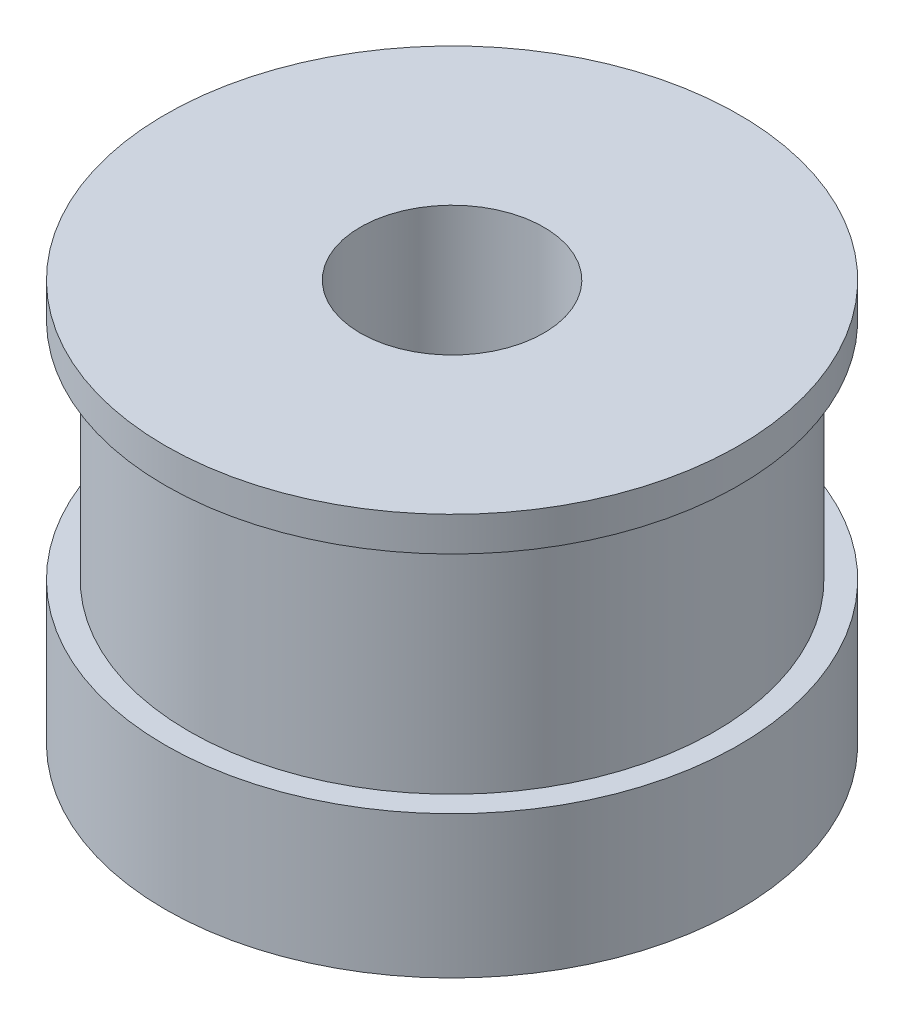
ISO-10303-21;
HEADER;
FILE_DESCRIPTION(('STEP AP214'),'2;1');
FILE_NAME('part.step','',(''),(''),'','','');
FILE_SCHEMA(('AUTOMOTIVE_DESIGN { 1 0 10303 214 1 1 1 1 }'));
ENDSEC;
DATA;
#1=APPLICATION_CONTEXT('core data for automotive mechanical design processes');
#2=APPLICATION_PROTOCOL_DEFINITION('international standard','automotive_design',2000,#1);
#3=PRODUCT_CONTEXT('',#1,'mechanical');
#4=PRODUCT('Part','Part','',(#3));
#5=PRODUCT_RELATED_PRODUCT_CATEGORY('part','',(#4));
#6=PRODUCT_DEFINITION_FORMATION('','',#4);
#7=PRODUCT_DEFINITION_CONTEXT('part definition',#1,'design');
#8=PRODUCT_DEFINITION('design','',#6,#7);
#9=PRODUCT_DEFINITION_SHAPE('','',#8);
#10=(LENGTH_UNIT() NAMED_UNIT(*) SI_UNIT(.MILLI.,.METRE.));
#11=(NAMED_UNIT(*) PLANE_ANGLE_UNIT() SI_UNIT($,.RADIAN.));
#12=(NAMED_UNIT(*) SI_UNIT($,.STERADIAN.) SOLID_ANGLE_UNIT());
#13=UNCERTAINTY_MEASURE_WITH_UNIT(LENGTH_MEASURE(1.E-05),#10,'distance_accuracy_value','');
#14=(GEOMETRIC_REPRESENTATION_CONTEXT(3) GLOBAL_UNCERTAINTY_ASSIGNED_CONTEXT((#13)) GLOBAL_UNIT_ASSIGNED_CONTEXT((#10,
#11,#12)) REPRESENTATION_CONTEXT('',''));
#15=CARTESIAN_POINT('',(0.,0.,0.));
#16=DIRECTION('',(0.,0.,1.));
#17=DIRECTION('',(1.,0.,0.));
#18=AXIS2_PLACEMENT_3D('',#15,#16,#17);
#19=CARTESIAN_POINT('',(0.,-2.55,-11.46));
#20=DIRECTION('',(0.,-1.,0.));
#21=DIRECTION('',(0.,0.,-1.));
#22=AXIS2_PLACEMENT_3D('',#19,#20,#21);
#23=PLANE('',#22);
#24=CARTESIAN_POINT('',(0.,-2.55,0.));
#25=DIRECTION('',(0.,1.,0.));
#26=DIRECTION('',(0.,0.,1.));
#27=AXIS2_PLACEMENT_3D('',#24,#25,#26);
#28=CIRCLE('',#27,11.46);
#29=CARTESIAN_POINT('',(0.,-2.55,11.46));
#30=VERTEX_POINT('',#29);
#31=EDGE_CURVE('E72',#30,#30,#28,.T.);
#32=ORIENTED_EDGE('',*,*,#31,.F.);
#33=EDGE_LOOP('',(#32));
#34=FACE_BOUND('',#33,.T.);
#35=CARTESIAN_POINT('',(0.,-2.55,0.));
#36=DIRECTION('',(0.,1.,0.));
#37=DIRECTION('',(0.,0.,1.));
#38=AXIS2_PLACEMENT_3D('',#35,#36,#37);
#39=CIRCLE('',#38,12.5);
#40=CARTESIAN_POINT('',(0.,-2.55,12.5));
#41=VERTEX_POINT('',#40);
#42=EDGE_CURVE('E10',#41,#41,#39,.T.);
#43=ORIENTED_EDGE('',*,*,#42,.T.);
#44=EDGE_LOOP('',(#43));
#45=FACE_BOUND('',#44,.T.);
#46=ADVANCED_FACE('F37',(#34,#45),#23,.F.);
#47=CARTESIAN_POINT('',(0.,10.3155225102178,0.));
#48=DIRECTION('',(0.,1.,0.));
#49=DIRECTION('',(0.,0.,1.));
#50=AXIS2_PLACEMENT_3D('',#47,#48,#49);
#51=CYLINDRICAL_SURFACE('',#50,12.5);
#52=ORIENTED_EDGE('',*,*,#42,.F.);
#53=EDGE_LOOP('',(#52));
#54=FACE_BOUND('',#53,.T.);
#55=CARTESIAN_POINT('',(0.,-8.75,0.));
#56=DIRECTION('',(0.,1.,0.));
#57=DIRECTION('',(0.,0.,1.));
#58=AXIS2_PLACEMENT_3D('',#55,#56,#57);
#59=CIRCLE('',#58,12.5);
#60=CARTESIAN_POINT('',(0.,-8.75,12.5));
#61=VERTEX_POINT('',#60);
#62=EDGE_CURVE('E44',#61,#61,#59,.T.);
#63=ORIENTED_EDGE('',*,*,#62,.T.);
#64=EDGE_LOOP('',(#63));
#65=FACE_BOUND('',#64,.T.);
#66=ADVANCED_FACE('F80',(#54,#65),#51,.T.);
#67=CARTESIAN_POINT('',(0.,-8.75,-12.5));
#68=DIRECTION('',(0.,1.,0.));
#69=DIRECTION('',(0.,0.,1.));
#70=AXIS2_PLACEMENT_3D('',#67,#68,#69);
#71=PLANE('',#70);
#72=ORIENTED_EDGE('',*,*,#62,.F.);
#73=EDGE_LOOP('',(#72));
#74=FACE_BOUND('',#73,.T.);
#75=CARTESIAN_POINT('',(0.,-8.75,0.));
#76=DIRECTION('',(0.,1.,0.));
#77=DIRECTION('',(0.,0.,1.));
#78=AXIS2_PLACEMENT_3D('',#75,#76,#77);
#79=CIRCLE('',#78,4.);
#80=CARTESIAN_POINT('',(0.,-8.75,4.));
#81=VERTEX_POINT('',#80);
#82=EDGE_CURVE('E49',#81,#81,#79,.T.);
#83=ORIENTED_EDGE('',*,*,#82,.T.);
#84=EDGE_LOOP('',(#83));
#85=FACE_BOUND('',#84,.T.);
#86=ADVANCED_FACE('F84',(#74,#85),#71,.F.);
#87=CARTESIAN_POINT('',(0.,10.3155225102178,0.));
#88=DIRECTION('',(0.,1.,0.));
#89=DIRECTION('',(0.,0.,1.));
#90=AXIS2_PLACEMENT_3D('',#87,#88,#89);
#91=CYLINDRICAL_SURFACE('',#90,4.);
#92=ORIENTED_EDGE('',*,*,#82,.F.);
#93=EDGE_LOOP('',(#92));
#94=FACE_BOUND('',#93,.T.);
#95=CARTESIAN_POINT('',(0.,8.75,0.));
#96=DIRECTION('',(0.,1.,0.));
#97=DIRECTION('',(0.,0.,1.));
#98=AXIS2_PLACEMENT_3D('',#95,#96,#97);
#99=CIRCLE('',#98,4.);
#100=CARTESIAN_POINT('',(0.,8.75,4.));
#101=VERTEX_POINT('',#100);
#102=EDGE_CURVE('E54',#101,#101,#99,.T.);
#103=ORIENTED_EDGE('',*,*,#102,.T.);
#104=EDGE_LOOP('',(#103));
#105=FACE_BOUND('',#104,.T.);
#106=ADVANCED_FACE('F89',(#94,#105),#91,.F.);
#107=CARTESIAN_POINT('',(0.,8.75,-12.5));
#108=DIRECTION('',(0.,-1.,0.));
#109=DIRECTION('',(0.,0.,-1.));
#110=AXIS2_PLACEMENT_3D('',#107,#108,#109);
#111=PLANE('',#110);
#112=ORIENTED_EDGE('',*,*,#102,.F.);
#113=EDGE_LOOP('',(#112));
#114=FACE_BOUND('',#113,.T.);
#115=CARTESIAN_POINT('',(0.,8.75,0.));
#116=DIRECTION('',(0.,1.,0.));
#117=DIRECTION('',(0.,0.,1.));
#118=AXIS2_PLACEMENT_3D('',#115,#116,#117);
#119=CIRCLE('',#118,12.5);
#120=CARTESIAN_POINT('',(0.,8.75,12.5));
#121=VERTEX_POINT('',#120);
#122=EDGE_CURVE('E60',#121,#121,#119,.T.);
#123=ORIENTED_EDGE('',*,*,#122,.T.);
#124=EDGE_LOOP('',(#123));
#125=FACE_BOUND('',#124,.T.);
#126=ADVANCED_FACE('F95',(#114,#125),#111,.F.);
#127=CARTESIAN_POINT('',(0.,10.3155225102178,0.));
#128=DIRECTION('',(0.,1.,0.));
#129=DIRECTION('',(0.,0.,1.));
#130=AXIS2_PLACEMENT_3D('',#127,#128,#129);
#131=CYLINDRICAL_SURFACE('',#130,12.5);
#132=ORIENTED_EDGE('',*,*,#122,.F.);
#133=EDGE_LOOP('',(#132));
#134=FACE_BOUND('',#133,.T.);
#135=CARTESIAN_POINT('',(0.,7.25,0.));
#136=DIRECTION('',(0.,1.,0.));
#137=DIRECTION('',(0.,0.,1.));
#138=AXIS2_PLACEMENT_3D('',#135,#136,#137);
#139=CIRCLE('',#138,12.5);
#140=CARTESIAN_POINT('',(0.,7.25,12.5));
#141=VERTEX_POINT('',#140);
#142=EDGE_CURVE('E64',#141,#141,#139,.T.);
#143=ORIENTED_EDGE('',*,*,#142,.T.);
#144=EDGE_LOOP('',(#143));
#145=FACE_BOUND('',#144,.T.);
#146=ADVANCED_FACE('F99',(#134,#145),#131,.T.);
#147=CARTESIAN_POINT('',(0.,7.25,-11.46));
#148=DIRECTION('',(0.,1.,0.));
#149=DIRECTION('',(0.,0.,1.));
#150=AXIS2_PLACEMENT_3D('',#147,#148,#149);
#151=PLANE('',#150);
#152=ORIENTED_EDGE('',*,*,#142,.F.);
#153=EDGE_LOOP('',(#152));
#154=FACE_BOUND('',#153,.T.);
#155=CARTESIAN_POINT('',(0.,7.25,0.));
#156=DIRECTION('',(0.,1.,0.));
#157=DIRECTION('',(0.,0.,1.));
#158=AXIS2_PLACEMENT_3D('',#155,#156,#157);
#159=CIRCLE('',#158,11.46);
#160=CARTESIAN_POINT('',(0.,7.25,11.46));
#161=VERTEX_POINT('',#160);
#162=EDGE_CURVE('E68',#161,#161,#159,.T.);
#163=ORIENTED_EDGE('',*,*,#162,.T.);
#164=EDGE_LOOP('',(#163));
#165=FACE_BOUND('',#164,.T.);
#166=ADVANCED_FACE('F103',(#154,#165),#151,.F.);
#167=CARTESIAN_POINT('',(0.,10.3155225102178,0.));
#168=DIRECTION('',(0.,1.,0.));
#169=DIRECTION('',(0.,0.,1.));
#170=AXIS2_PLACEMENT_3D('',#167,#168,#169);
#171=CYLINDRICAL_SURFACE('',#170,11.46);
#172=ORIENTED_EDGE('',*,*,#162,.F.);
#173=EDGE_LOOP('',(#172));
#174=FACE_BOUND('',#173,.T.);
#175=ORIENTED_EDGE('',*,*,#31,.T.);
#176=EDGE_LOOP('',(#175));
#177=FACE_BOUND('',#176,.T.);
#178=ADVANCED_FACE('F77',(#174,#177),#171,.T.);
#179=CLOSED_SHELL('',(#46,#66,#86,#106,#126,#146,#166,#178));
#180=MANIFOLD_SOLID_BREP('B2',#179);
#181=ADVANCED_BREP_SHAPE_REPRESENTATION('',(#18,#180),#14);
#182=SHAPE_DEFINITION_REPRESENTATION(#9,#181);
ENDSEC;
END-ISO-10303-21;
